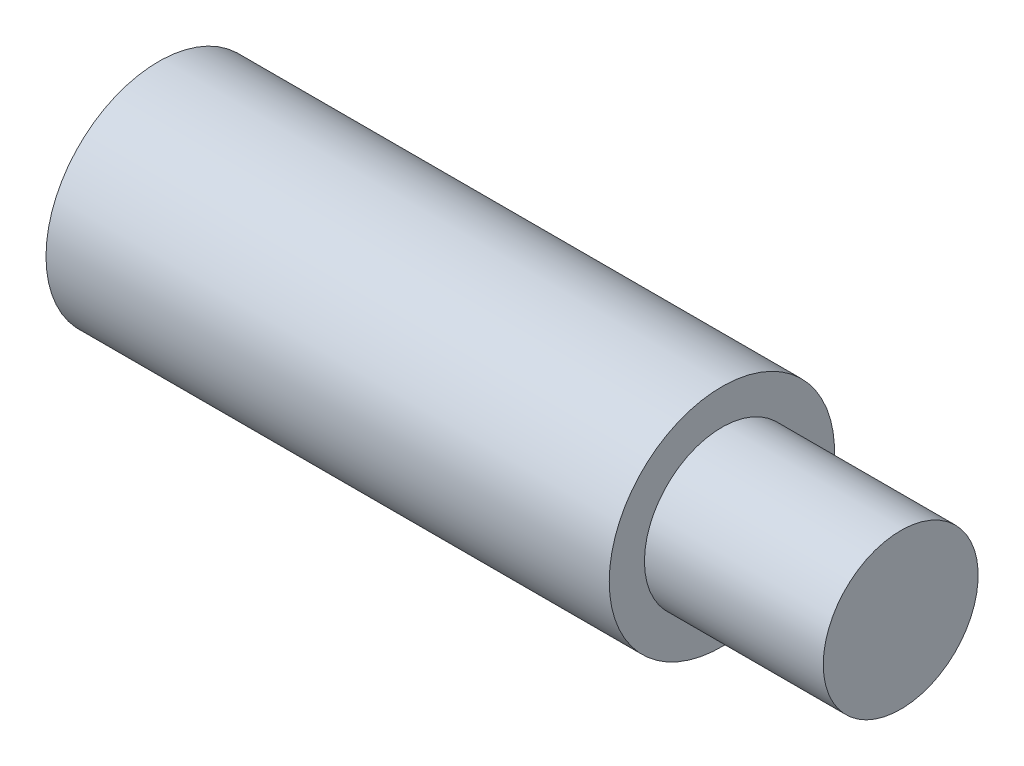
ISO-10303-21;
HEADER;
FILE_DESCRIPTION(('STEP AP214'),'2;1');
FILE_NAME('part.step','',(''),(''),'','','');
FILE_SCHEMA(('AUTOMOTIVE_DESIGN { 1 0 10303 214 1 1 1 1 }'));
ENDSEC;
DATA;
#1=APPLICATION_CONTEXT('core data for automotive mechanical design processes');
#2=APPLICATION_PROTOCOL_DEFINITION('international standard','automotive_design',2000,#1);
#3=PRODUCT_CONTEXT('',#1,'mechanical');
#4=PRODUCT('Part','Part','',(#3));
#5=PRODUCT_RELATED_PRODUCT_CATEGORY('part','',(#4));
#6=PRODUCT_DEFINITION_FORMATION('','',#4);
#7=PRODUCT_DEFINITION_CONTEXT('part definition',#1,'design');
#8=PRODUCT_DEFINITION('design','',#6,#7);
#9=PRODUCT_DEFINITION_SHAPE('','',#8);
#10=(LENGTH_UNIT() NAMED_UNIT(*) SI_UNIT(.MILLI.,.METRE.));
#11=(NAMED_UNIT(*) PLANE_ANGLE_UNIT() SI_UNIT($,.RADIAN.));
#12=(NAMED_UNIT(*) SI_UNIT($,.STERADIAN.) SOLID_ANGLE_UNIT());
#13=UNCERTAINTY_MEASURE_WITH_UNIT(LENGTH_MEASURE(1.E-05),#10,'distance_accuracy_value','');
#14=(GEOMETRIC_REPRESENTATION_CONTEXT(3) GLOBAL_UNCERTAINTY_ASSIGNED_CONTEXT((#13)) GLOBAL_UNIT_ASSIGNED_CONTEXT((#10,
#11,#12)) REPRESENTATION_CONTEXT('',''));
#15=CARTESIAN_POINT('',(0.,0.,0.));
#16=DIRECTION('',(0.,0.,1.));
#17=DIRECTION('',(1.,0.,0.));
#18=AXIS2_PLACEMENT_3D('',#15,#16,#17);
#19=CARTESIAN_POINT('',(12.7,0.,0.));
#20=DIRECTION('',(-1.,0.,0.));
#21=DIRECTION('',(0.,0.,1.));
#22=AXIS2_PLACEMENT_3D('',#19,#20,#21);
#23=PLANE('',#22);
#24=CARTESIAN_POINT('',(12.6999999999999,0.,0.));
#25=DIRECTION('',(-1.,0.,0.));
#26=DIRECTION('',(0.,0.,1.));
#27=AXIS2_PLACEMENT_3D('',#24,#25,#26);
#28=CIRCLE('',#27,5.5);
#29=CARTESIAN_POINT('',(12.6999999999999,0.,5.5));
#30=VERTEX_POINT('',#29);
#31=EDGE_CURVE('E10',#30,#30,#28,.T.);
#32=ORIENTED_EDGE('',*,*,#31,.F.);
#33=EDGE_LOOP('',(#32));
#34=FACE_BOUND('',#33,.T.);
#35=ADVANCED_FACE('F39',(#34),#23,.F.);
#36=CARTESIAN_POINT('',(-1000.,0.,0.));
#37=DIRECTION('',(-1.,0.,0.));
#38=DIRECTION('',(0.,0.,1.));
#39=AXIS2_PLACEMENT_3D('',#36,#37,#38);
#40=CYLINDRICAL_SURFACE('',#39,5.5);
#41=CARTESIAN_POINT('',(0.,0.,0.));
#42=DIRECTION('',(-1.,0.,0.));
#43=DIRECTION('',(0.,0.,1.));
#44=AXIS2_PLACEMENT_3D('',#41,#42,#43);
#45=CIRCLE('',#44,5.5);
#46=CARTESIAN_POINT('',(0.,0.,5.5));
#47=VERTEX_POINT('',#46);
#48=EDGE_CURVE('E44',#47,#47,#45,.T.);
#49=ORIENTED_EDGE('',*,*,#48,.F.);
#50=EDGE_LOOP('',(#49));
#51=FACE_BOUND('',#50,.T.);
#52=ORIENTED_EDGE('',*,*,#31,.T.);
#53=EDGE_LOOP('',(#52));
#54=FACE_BOUND('',#53,.T.);
#55=ADVANCED_FACE('F68',(#51,#54),#40,.T.);
#56=CARTESIAN_POINT('',(0.,5.5,0.));
#57=DIRECTION('',(-1.,0.,0.));
#58=DIRECTION('',(0.,0.,1.));
#59=AXIS2_PLACEMENT_3D('',#56,#57,#58);
#60=PLANE('',#59);
#61=CARTESIAN_POINT('',(0.,0.,0.));
#62=DIRECTION('',(-1.,0.,0.));
#63=DIRECTION('',(0.,0.,1.));
#64=AXIS2_PLACEMENT_3D('',#61,#62,#63);
#65=CIRCLE('',#64,8.);
#66=CARTESIAN_POINT('',(0.,0.,8.));
#67=VERTEX_POINT('',#66);
#68=EDGE_CURVE('E47',#67,#67,#65,.T.);
#69=ORIENTED_EDGE('',*,*,#68,.F.);
#70=EDGE_LOOP('',(#69));
#71=FACE_BOUND('',#70,.T.);
#72=ORIENTED_EDGE('',*,*,#48,.T.);
#73=EDGE_LOOP('',(#72));
#74=FACE_BOUND('',#73,.T.);
#75=ADVANCED_FACE('F61',(#71,#74),#60,.F.);
#76=CARTESIAN_POINT('',(-1000.,0.,0.));
#77=DIRECTION('',(-1.,0.,0.));
#78=DIRECTION('',(0.,0.,1.));
#79=AXIS2_PLACEMENT_3D('',#76,#77,#78);
#80=CYLINDRICAL_SURFACE('',#79,8.);
#81=CARTESIAN_POINT('',(-40.,0.,0.));
#82=DIRECTION('',(-1.,0.,0.));
#83=DIRECTION('',(0.,0.,1.));
#84=AXIS2_PLACEMENT_3D('',#81,#82,#83);
#85=CIRCLE('',#84,8.);
#86=CARTESIAN_POINT('',(-40.,0.,8.));
#87=VERTEX_POINT('',#86);
#88=EDGE_CURVE('E52',#87,#87,#85,.T.);
#89=ORIENTED_EDGE('',*,*,#88,.F.);
#90=EDGE_LOOP('',(#89));
#91=FACE_BOUND('',#90,.T.);
#92=ORIENTED_EDGE('',*,*,#68,.T.);
#93=EDGE_LOOP('',(#92));
#94=FACE_BOUND('',#93,.T.);
#95=ADVANCED_FACE('F62',(#91,#94),#80,.T.);
#96=CARTESIAN_POINT('',(-40.,8.,0.));
#97=DIRECTION('',(1.,0.,0.));
#98=DIRECTION('',(0.,0.,-1.));
#99=AXIS2_PLACEMENT_3D('',#96,#97,#98);
#100=PLANE('',#99);
#101=ORIENTED_EDGE('',*,*,#88,.T.);
#102=EDGE_LOOP('',(#101));
#103=FACE_BOUND('',#102,.T.);
#104=ADVANCED_FACE('F56',(#103),#100,.F.);
#105=CLOSED_SHELL('',(#35,#55,#75,#95,#104));
#106=MANIFOLD_SOLID_BREP('B2',#105);
#107=ADVANCED_BREP_SHAPE_REPRESENTATION('',(#18,#106),#14);
#108=SHAPE_DEFINITION_REPRESENTATION(#9,#107);
ENDSEC;
END-ISO-10303-21;
